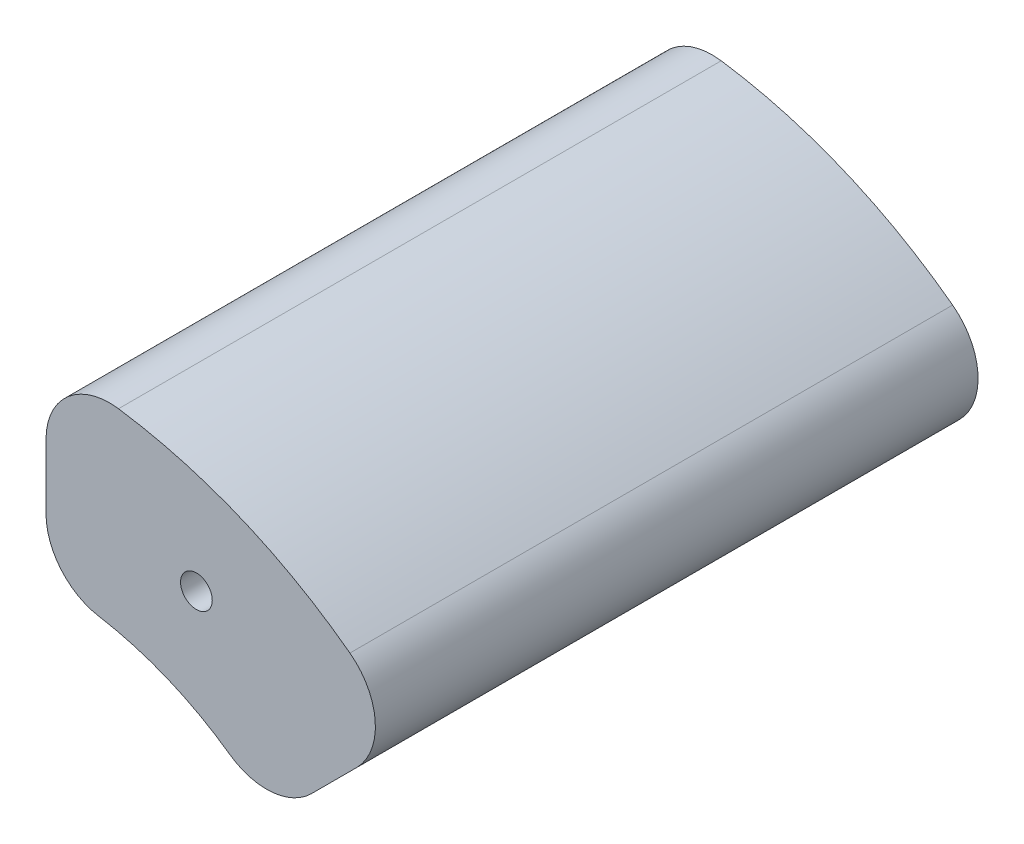
ISO-10303-21;
HEADER;
FILE_DESCRIPTION(('STEP AP214'),'2;1');
FILE_NAME('part.step','',(''),(''),'','','');
FILE_SCHEMA(('AUTOMOTIVE_DESIGN { 1 0 10303 214 1 1 1 1 }'));
ENDSEC;
DATA;
#1=APPLICATION_CONTEXT('core data for automotive mechanical design processes');
#2=APPLICATION_PROTOCOL_DEFINITION('international standard','automotive_design',2000,#1);
#3=PRODUCT_CONTEXT('',#1,'mechanical');
#4=PRODUCT('Part','Part','',(#3));
#5=PRODUCT_RELATED_PRODUCT_CATEGORY('part','',(#4));
#6=PRODUCT_DEFINITION_FORMATION('','',#4);
#7=PRODUCT_DEFINITION_CONTEXT('part definition',#1,'design');
#8=PRODUCT_DEFINITION('design','',#6,#7);
#9=PRODUCT_DEFINITION_SHAPE('','',#8);
#10=(LENGTH_UNIT() NAMED_UNIT(*) SI_UNIT(.MILLI.,.METRE.));
#11=(NAMED_UNIT(*) PLANE_ANGLE_UNIT() SI_UNIT($,.RADIAN.));
#12=(NAMED_UNIT(*) SI_UNIT($,.STERADIAN.) SOLID_ANGLE_UNIT());
#13=UNCERTAINTY_MEASURE_WITH_UNIT(LENGTH_MEASURE(1.E-05),#10,'distance_accuracy_value','');
#14=(GEOMETRIC_REPRESENTATION_CONTEXT(3) GLOBAL_UNCERTAINTY_ASSIGNED_CONTEXT((#13)) GLOBAL_UNIT_ASSIGNED_CONTEXT((#10,
#11,#12)) REPRESENTATION_CONTEXT('',''));
#15=CARTESIAN_POINT('',(0.,0.,0.));
#16=DIRECTION('',(0.,0.,1.));
#17=DIRECTION('',(1.,0.,0.));
#18=AXIS2_PLACEMENT_3D('',#15,#16,#17);
#19=CARTESIAN_POINT('',(0.,0.,95.));
#20=DIRECTION('',(0.,0.,1.));
#21=DIRECTION('',(1.,0.,0.));
#22=AXIS2_PLACEMENT_3D('',#19,#20,#21);
#23=PLANE('',#22);
#24=CARTESIAN_POINT('',(0.,0.,95.));
#25=DIRECTION('',(0.,0.,1.));
#26=DIRECTION('',(1.,0.,0.));
#27=AXIS2_PLACEMENT_3D('',#24,#25,#26);
#28=CIRCLE('',#27,80.);
#29=CARTESIAN_POINT('',(47.9071166214837,64.0695573343188,95.));
#30=VERTEX_POINT('',#29);
#31=CARTESIAN_POINT('',(11.4285714285714,79.179465488863,95.));
#32=VERTEX_POINT('',#31);
#33=EDGE_CURVE('E143',#30,#32,#28,.T.);
#34=ORIENTED_EDGE('',*,*,#33,.T.);
#35=CARTESIAN_POINT('',(10.,69.2820323027551,95.));
#36=DIRECTION('',(0.,0.,1.));
#37=DIRECTION('',(1.,0.,0.));
#38=AXIS2_PLACEMENT_3D('',#35,#36,#37);
#39=CIRCLE('',#38,10.);
#40=CARTESIAN_POINT('',(0.,69.2820323027551,95.));
#41=VERTEX_POINT('',#40);
#42=EDGE_CURVE('E157',#32,#41,#39,.T.);
#43=ORIENTED_EDGE('',*,*,#42,.T.);
#44=DIRECTION('',(0.,-1.,0.));
#45=VECTOR('',#44,1.);
#46=CARTESIAN_POINT('',(0.,50.,95.));
#47=LINE('',#46,#45);
#48=CARTESIAN_POINT('',(0.,59.1607978309962,95.));
#49=VERTEX_POINT('',#48);
#50=EDGE_CURVE('E124',#41,#49,#47,.T.);
#51=ORIENTED_EDGE('',*,*,#50,.T.);
#52=CARTESIAN_POINT('',(10.,59.1607978309962,95.));
#53=DIRECTION('',(0.,0.,1.));
#54=DIRECTION('',(1.,0.,0.));
#55=AXIS2_PLACEMENT_3D('',#52,#53,#54);
#56=CIRCLE('',#55,10.);
#57=CARTESIAN_POINT('',(8.33333333333333,49.3006648591635,95.));
#58=VERTEX_POINT('',#57);
#59=EDGE_CURVE('E153',#49,#58,#56,.T.);
#60=ORIENTED_EDGE('',*,*,#59,.T.);
#61=CARTESIAN_POINT('',(0.,0.,95.));
#62=DIRECTION('',(0.,0.,-1.));
#63=DIRECTION('',(1.,0.,0.));
#64=AXIS2_PLACEMENT_3D('',#61,#62,#63);
#65=CIRCLE('',#64,50.);
#66=CARTESIAN_POINT('',(28.968277929032,40.7533909488077,95.));
#67=VERTEX_POINT('',#66);
#68=EDGE_CURVE('E166',#58,#67,#65,.T.);
#69=ORIENTED_EDGE('',*,*,#68,.T.);
#70=CARTESIAN_POINT('',(34.7619335148384,48.9040691385692,95.));
#71=DIRECTION('',(0.,0.,1.));
#72=DIRECTION('',(1.,0.,0.));
#73=AXIS2_PLACEMENT_3D('',#70,#71,#72);
#74=CIRCLE('',#73,10.);
#75=CARTESIAN_POINT('',(41.8330013267039,41.8330013267037,95.));
#76=VERTEX_POINT('',#75);
#77=EDGE_CURVE('E59',#67,#76,#74,.T.);
#78=ORIENTED_EDGE('',*,*,#77,.T.);
#79=DIRECTION('',(0.707106781186549,0.707106781186546,0.));
#80=VECTOR('',#79,1.);
#81=CARTESIAN_POINT('',(35.3553390593274,35.3553390593273,95.));
#82=LINE('',#81,#80);
#83=CARTESIAN_POINT('',(48.9897948556637,48.9897948556635,95.));
#84=VERTEX_POINT('',#83);
#85=EDGE_CURVE('E144',#76,#84,#82,.T.);
#86=ORIENTED_EDGE('',*,*,#85,.T.);
#87=CARTESIAN_POINT('',(41.9187270437982,56.060862667529,95.));
#88=DIRECTION('',(0.,0.,1.));
#89=DIRECTION('',(1.,0.,0.));
#90=AXIS2_PLACEMENT_3D('',#87,#88,#89);
#91=CIRCLE('',#90,10.);
#92=EDGE_CURVE('E155',#84,#30,#91,.T.);
#93=ORIENTED_EDGE('',*,*,#92,.T.);
#94=EDGE_LOOP('',(#34,#43,#51,#60,#69,#78,#86,#93));
#95=FACE_BOUND('',#94,.T.);
#96=CARTESIAN_POINT('',(23.7080647304559,60.4107705114764,95.));
#97=DIRECTION('',(0.,0.,1.));
#98=DIRECTION('',(1.,0.,0.));
#99=AXIS2_PLACEMENT_3D('',#96,#97,#98);
#100=CIRCLE('',#99,2.50000000000001);
#101=CARTESIAN_POINT('',(26.2080647304559,60.4107705114764,95.));
#102=VERTEX_POINT('',#101);
#103=EDGE_CURVE('E138',#102,#102,#100,.T.);
#104=ORIENTED_EDGE('',*,*,#103,.F.);
#105=EDGE_LOOP('',(#104));
#106=FACE_BOUND('',#105,.T.);
#107=ADVANCED_FACE('F37',(#95,#106),#23,.T.);
#108=CARTESIAN_POINT('',(0.,0.,0.));
#109=DIRECTION('',(0.,0.,1.));
#110=DIRECTION('',(1.,0.,0.));
#111=AXIS2_PLACEMENT_3D('',#108,#109,#110);
#112=PLANE('',#111);
#113=DIRECTION('',(0.,-1.,0.));
#114=VECTOR('',#113,1.);
#115=CARTESIAN_POINT('',(0.,50.,0.));
#116=LINE('',#115,#114);
#117=CARTESIAN_POINT('',(0.,69.2820323027551,0.));
#118=VERTEX_POINT('',#117);
#119=CARTESIAN_POINT('',(0.,59.1607978309962,0.));
#120=VERTEX_POINT('',#119);
#121=EDGE_CURVE('E121',#118,#120,#116,.T.);
#122=ORIENTED_EDGE('',*,*,#121,.F.);
#123=CARTESIAN_POINT('',(10.,69.2820323027551,0.));
#124=DIRECTION('',(0.,0.,1.));
#125=DIRECTION('',(1.,0.,0.));
#126=AXIS2_PLACEMENT_3D('',#123,#124,#125);
#127=CIRCLE('',#126,10.);
#128=CARTESIAN_POINT('',(11.4285714285714,79.179465488863,0.));
#129=VERTEX_POINT('',#128);
#130=EDGE_CURVE('E104',#118,#129,#127,.F.);
#131=ORIENTED_EDGE('',*,*,#130,.T.);
#132=CARTESIAN_POINT('',(0.,0.,0.));
#133=DIRECTION('',(0.,0.,1.));
#134=DIRECTION('',(1.,0.,0.));
#135=AXIS2_PLACEMENT_3D('',#132,#133,#134);
#136=CIRCLE('',#135,80.);
#137=CARTESIAN_POINT('',(47.9071166214837,64.0695573343188,0.));
#138=VERTEX_POINT('',#137);
#139=EDGE_CURVE('E133',#138,#129,#136,.T.);
#140=ORIENTED_EDGE('',*,*,#139,.F.);
#141=CARTESIAN_POINT('',(41.9187270437982,56.060862667529,0.));
#142=DIRECTION('',(0.,0.,1.));
#143=DIRECTION('',(1.,0.,0.));
#144=AXIS2_PLACEMENT_3D('',#141,#142,#143);
#145=CIRCLE('',#144,10.);
#146=CARTESIAN_POINT('',(48.9897948556637,48.9897948556635,0.));
#147=VERTEX_POINT('',#146);
#148=EDGE_CURVE('E115',#138,#147,#145,.F.);
#149=ORIENTED_EDGE('',*,*,#148,.T.);
#150=DIRECTION('',(0.707106781186549,0.707106781186546,0.));
#151=VECTOR('',#150,1.);
#152=CARTESIAN_POINT('',(35.3553390593274,35.3553390593273,0.));
#153=LINE('',#152,#151);
#154=CARTESIAN_POINT('',(41.8330013267039,41.8330013267037,0.));
#155=VERTEX_POINT('',#154);
#156=EDGE_CURVE('E136',#155,#147,#153,.T.);
#157=ORIENTED_EDGE('',*,*,#156,.F.);
#158=CARTESIAN_POINT('',(34.7619335148384,48.9040691385692,0.));
#159=DIRECTION('',(0.,0.,1.));
#160=DIRECTION('',(1.,0.,0.));
#161=AXIS2_PLACEMENT_3D('',#158,#159,#160);
#162=CIRCLE('',#161,10.);
#163=CARTESIAN_POINT('',(28.968277929032,40.7533909488077,0.));
#164=VERTEX_POINT('',#163);
#165=EDGE_CURVE('E125',#155,#164,#162,.F.);
#166=ORIENTED_EDGE('',*,*,#165,.T.);
#167=CARTESIAN_POINT('',(0.,0.,0.));
#168=DIRECTION('',(0.,0.,-1.));
#169=DIRECTION('',(1.,0.,0.));
#170=AXIS2_PLACEMENT_3D('',#167,#168,#169);
#171=CIRCLE('',#170,50.);
#172=CARTESIAN_POINT('',(8.33333333333333,49.3006648591635,0.));
#173=VERTEX_POINT('',#172);
#174=EDGE_CURVE('E132',#173,#164,#171,.T.);
#175=ORIENTED_EDGE('',*,*,#174,.F.);
#176=CARTESIAN_POINT('',(10.,59.1607978309962,0.));
#177=DIRECTION('',(0.,0.,1.));
#178=DIRECTION('',(1.,0.,0.));
#179=AXIS2_PLACEMENT_3D('',#176,#177,#178);
#180=CIRCLE('',#179,10.);
#181=EDGE_CURVE('E131',#173,#120,#180,.F.);
#182=ORIENTED_EDGE('',*,*,#181,.T.);
#183=EDGE_LOOP('',(#122,#131,#140,#149,#157,#166,#175,#182));
#184=FACE_BOUND('',#183,.T.);
#185=CARTESIAN_POINT('',(23.7080647304559,60.4107705114764,0.));
#186=DIRECTION('',(0.,0.,1.));
#187=DIRECTION('',(1.,0.,0.));
#188=AXIS2_PLACEMENT_3D('',#185,#186,#187);
#189=CIRCLE('',#188,2.50000000000001);
#190=CARTESIAN_POINT('',(26.2080647304559,60.4107705114764,0.));
#191=VERTEX_POINT('',#190);
#192=EDGE_CURVE('E186',#191,#191,#189,.T.);
#193=ORIENTED_EDGE('',*,*,#192,.T.);
#194=EDGE_LOOP('',(#193));
#195=FACE_BOUND('',#194,.T.);
#196=ADVANCED_FACE('F128',(#184,#195),#112,.F.);
#197=CARTESIAN_POINT('',(0.,0.,95.));
#198=DIRECTION('',(0.,0.,-1.));
#199=DIRECTION('',(-1.,0.,0.));
#200=AXIS2_PLACEMENT_3D('',#197,#198,#199);
#201=CYLINDRICAL_SURFACE('',#200,80.);
#202=ORIENTED_EDGE('',*,*,#139,.T.);
#203=DIRECTION('',(0.,0.,-1.));
#204=VECTOR('',#203,1.);
#205=CARTESIAN_POINT('',(11.4285714285714,79.179465488863,95.));
#206=LINE('',#205,#204);
#207=EDGE_CURVE('E109',#129,#32,#206,.F.);
#208=ORIENTED_EDGE('',*,*,#207,.T.);
#209=ORIENTED_EDGE('',*,*,#33,.F.);
#210=DIRECTION('',(0.,0.,-1.));
#211=VECTOR('',#210,1.);
#212=CARTESIAN_POINT('',(47.9071166214837,64.0695573343188,95.));
#213=LINE('',#212,#211);
#214=EDGE_CURVE('E114',#30,#138,#213,.T.);
#215=ORIENTED_EDGE('',*,*,#214,.T.);
#216=EDGE_LOOP('',(#202,#208,#209,#215));
#217=FACE_BOUND('',#216,.T.);
#218=ADVANCED_FACE('F182',(#217),#201,.T.);
#219=CARTESIAN_POINT('',(0.,50.,95.));
#220=DIRECTION('',(1.,0.,0.));
#221=DIRECTION('',(0.,0.,-1.));
#222=AXIS2_PLACEMENT_3D('',#219,#220,#221);
#223=PLANE('',#222);
#224=ORIENTED_EDGE('',*,*,#50,.F.);
#225=DIRECTION('',(0.,0.,-1.));
#226=VECTOR('',#225,1.);
#227=CARTESIAN_POINT('',(0.,69.2820323027551,95.));
#228=LINE('',#227,#226);
#229=EDGE_CURVE('E108',#41,#118,#228,.T.);
#230=ORIENTED_EDGE('',*,*,#229,.T.);
#231=ORIENTED_EDGE('',*,*,#121,.T.);
#232=DIRECTION('',(0.,0.,-1.));
#233=VECTOR('',#232,1.);
#234=CARTESIAN_POINT('',(0.,59.1607978309962,95.));
#235=LINE('',#234,#233);
#236=EDGE_CURVE('E126',#120,#49,#235,.F.);
#237=ORIENTED_EDGE('',*,*,#236,.T.);
#238=EDGE_LOOP('',(#224,#230,#231,#237));
#239=FACE_BOUND('',#238,.T.);
#240=ADVANCED_FACE('F120',(#239),#223,.F.);
#241=CARTESIAN_POINT('',(0.,0.,95.));
#242=DIRECTION('',(0.,0.,-1.));
#243=DIRECTION('',(-1.,0.,0.));
#244=AXIS2_PLACEMENT_3D('',#241,#242,#243);
#245=CYLINDRICAL_SURFACE('',#244,50.);
#246=ORIENTED_EDGE('',*,*,#68,.F.);
#247=DIRECTION('',(0.,0.,-1.));
#248=VECTOR('',#247,1.);
#249=CARTESIAN_POINT('',(8.33333333333333,49.3006648591635,95.));
#250=LINE('',#249,#248);
#251=EDGE_CURVE('E11',#58,#173,#250,.T.);
#252=ORIENTED_EDGE('',*,*,#251,.T.);
#253=ORIENTED_EDGE('',*,*,#174,.T.);
#254=DIRECTION('',(0.,0.,-1.));
#255=VECTOR('',#254,1.);
#256=CARTESIAN_POINT('',(28.968277929032,40.7533909488077,95.));
#257=LINE('',#256,#255);
#258=EDGE_CURVE('E45',#164,#67,#257,.F.);
#259=ORIENTED_EDGE('',*,*,#258,.T.);
#260=EDGE_LOOP('',(#246,#252,#253,#259));
#261=FACE_BOUND('',#260,.T.);
#262=ADVANCED_FACE('F165',(#261),#245,.F.);
#263=CARTESIAN_POINT('',(35.3553390593274,35.3553390593273,95.));
#264=DIRECTION('',(-0.707106781186546,0.707106781186549,0.));
#265=DIRECTION('',(-0.707106781186549,-0.707106781186546,0.));
#266=AXIS2_PLACEMENT_3D('',#263,#264,#265);
#267=PLANE('',#266);
#268=ORIENTED_EDGE('',*,*,#156,.T.);
#269=DIRECTION('',(0.,0.,-1.));
#270=VECTOR('',#269,1.);
#271=CARTESIAN_POINT('',(48.9897948556637,48.9897948556635,95.));
#272=LINE('',#271,#270);
#273=EDGE_CURVE('E52',#147,#84,#272,.F.);
#274=ORIENTED_EDGE('',*,*,#273,.T.);
#275=ORIENTED_EDGE('',*,*,#85,.F.);
#276=DIRECTION('',(0.,0.,-1.));
#277=VECTOR('',#276,1.);
#278=CARTESIAN_POINT('',(41.8330013267039,41.8330013267037,95.));
#279=LINE('',#278,#277);
#280=EDGE_CURVE('E159',#76,#155,#279,.T.);
#281=ORIENTED_EDGE('',*,*,#280,.T.);
#282=EDGE_LOOP('',(#268,#274,#275,#281));
#283=FACE_BOUND('',#282,.T.);
#284=ADVANCED_FACE('F175',(#283),#267,.F.);
#285=CARTESIAN_POINT('',(23.7080647304559,60.4107705114764,95.));
#286=DIRECTION('',(0.,0.,-1.));
#287=DIRECTION('',(-1.,0.,0.));
#288=AXIS2_PLACEMENT_3D('',#285,#286,#287);
#289=CYLINDRICAL_SURFACE('',#288,2.50000000000001);
#290=ORIENTED_EDGE('',*,*,#103,.T.);
#291=EDGE_LOOP('',(#290));
#292=FACE_BOUND('',#291,.T.);
#293=ORIENTED_EDGE('',*,*,#192,.F.);
#294=EDGE_LOOP('',(#293));
#295=FACE_BOUND('',#294,.T.);
#296=ADVANCED_FACE('F192',(#292,#295),#289,.F.);
#297=CARTESIAN_POINT('',(10.,69.2820323027551,95.));
#298=DIRECTION('',(0.,0.,-1.));
#299=DIRECTION('',(-1.,0.,0.));
#300=AXIS2_PLACEMENT_3D('',#297,#298,#299);
#301=CYLINDRICAL_SURFACE('',#300,10.);
#302=ORIENTED_EDGE('',*,*,#42,.F.);
#303=ORIENTED_EDGE('',*,*,#207,.F.);
#304=ORIENTED_EDGE('',*,*,#130,.F.);
#305=ORIENTED_EDGE('',*,*,#229,.F.);
#306=EDGE_LOOP('',(#302,#303,#304,#305));
#307=FACE_BOUND('',#306,.T.);
#308=ADVANCED_FACE('F107',(#307),#301,.T.);
#309=CARTESIAN_POINT('',(41.9187270437982,56.060862667529,95.));
#310=DIRECTION('',(0.,0.,-1.));
#311=DIRECTION('',(-1.,0.,0.));
#312=AXIS2_PLACEMENT_3D('',#309,#310,#311);
#313=CYLINDRICAL_SURFACE('',#312,10.);
#314=ORIENTED_EDGE('',*,*,#92,.F.);
#315=ORIENTED_EDGE('',*,*,#273,.F.);
#316=ORIENTED_EDGE('',*,*,#148,.F.);
#317=ORIENTED_EDGE('',*,*,#214,.F.);
#318=EDGE_LOOP('',(#314,#315,#316,#317));
#319=FACE_BOUND('',#318,.T.);
#320=ADVANCED_FACE('F179',(#319),#313,.T.);
#321=CARTESIAN_POINT('',(10.,59.1607978309962,95.));
#322=DIRECTION('',(0.,0.,-1.));
#323=DIRECTION('',(-1.,0.,0.));
#324=AXIS2_PLACEMENT_3D('',#321,#322,#323);
#325=CYLINDRICAL_SURFACE('',#324,10.);
#326=ORIENTED_EDGE('',*,*,#59,.F.);
#327=ORIENTED_EDGE('',*,*,#236,.F.);
#328=ORIENTED_EDGE('',*,*,#181,.F.);
#329=ORIENTED_EDGE('',*,*,#251,.F.);
#330=EDGE_LOOP('',(#326,#327,#328,#329));
#331=FACE_BOUND('',#330,.T.);
#332=ADVANCED_FACE('F213',(#331),#325,.T.);
#333=CARTESIAN_POINT('',(34.7619335148384,48.9040691385692,95.));
#334=DIRECTION('',(0.,0.,-1.));
#335=DIRECTION('',(-1.,0.,0.));
#336=AXIS2_PLACEMENT_3D('',#333,#334,#335);
#337=CYLINDRICAL_SURFACE('',#336,10.);
#338=ORIENTED_EDGE('',*,*,#77,.F.);
#339=ORIENTED_EDGE('',*,*,#258,.F.);
#340=ORIENTED_EDGE('',*,*,#165,.F.);
#341=ORIENTED_EDGE('',*,*,#280,.F.);
#342=EDGE_LOOP('',(#338,#339,#340,#341));
#343=FACE_BOUND('',#342,.T.);
#344=ADVANCED_FACE('F39',(#343),#337,.T.);
#345=CLOSED_SHELL('',(#107,#196,#218,#240,#262,#284,#296,#308,#320,#332,#344));
#346=MANIFOLD_SOLID_BREP('B2',#345);
#347=ADVANCED_BREP_SHAPE_REPRESENTATION('',(#18,#346),#14);
#348=SHAPE_DEFINITION_REPRESENTATION(#9,#347);
ENDSEC;
END-ISO-10303-21;
